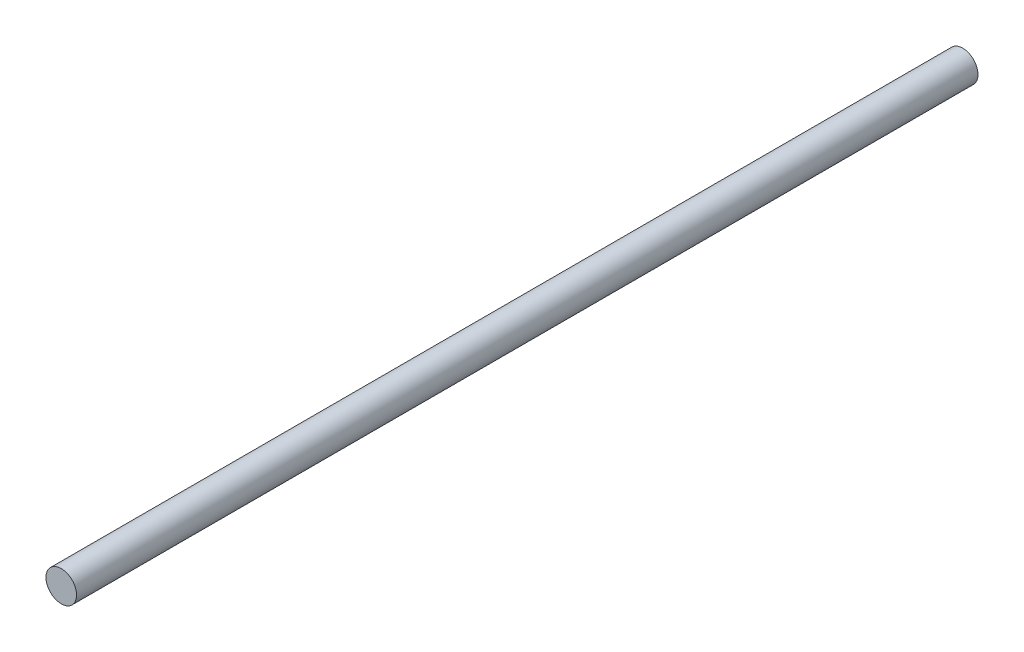
ISO-10303-21;
HEADER;
FILE_DESCRIPTION(('STEP AP214'),'2;1');
FILE_NAME('part.step','',(''),(''),'','','');
FILE_SCHEMA(('AUTOMOTIVE_DESIGN { 1 0 10303 214 1 1 1 1 }'));
ENDSEC;
DATA;
#1=APPLICATION_CONTEXT('core data for automotive mechanical design processes');
#2=APPLICATION_PROTOCOL_DEFINITION('international standard','automotive_design',2000,#1);
#3=PRODUCT_CONTEXT('',#1,'mechanical');
#4=PRODUCT('Part','Part','',(#3));
#5=PRODUCT_RELATED_PRODUCT_CATEGORY('part','',(#4));
#6=PRODUCT_DEFINITION_FORMATION('','',#4);
#7=PRODUCT_DEFINITION_CONTEXT('part definition',#1,'design');
#8=PRODUCT_DEFINITION('design','',#6,#7);
#9=PRODUCT_DEFINITION_SHAPE('','',#8);
#10=(LENGTH_UNIT() NAMED_UNIT(*) SI_UNIT(.MILLI.,.METRE.));
#11=(NAMED_UNIT(*) PLANE_ANGLE_UNIT() SI_UNIT($,.RADIAN.));
#12=(NAMED_UNIT(*) SI_UNIT($,.STERADIAN.) SOLID_ANGLE_UNIT());
#13=UNCERTAINTY_MEASURE_WITH_UNIT(LENGTH_MEASURE(1.E-05),#10,'distance_accuracy_value','');
#14=(GEOMETRIC_REPRESENTATION_CONTEXT(3) GLOBAL_UNCERTAINTY_ASSIGNED_CONTEXT((#13)) GLOBAL_UNIT_ASSIGNED_CONTEXT((#10,
#11,#12)) REPRESENTATION_CONTEXT('',''));
#15=CARTESIAN_POINT('',(0.,0.,0.));
#16=DIRECTION('',(0.,0.,1.));
#17=DIRECTION('',(1.,0.,0.));
#18=AXIS2_PLACEMENT_3D('',#15,#16,#17);
#19=CARTESIAN_POINT('',(0.,0.,115.));
#20=DIRECTION('',(0.,0.,-1.));
#21=DIRECTION('',(-1.,0.,0.));
#22=AXIS2_PLACEMENT_3D('',#19,#20,#21);
#23=CYLINDRICAL_SURFACE('',#22,1.95);
#24=CARTESIAN_POINT('',(0.,0.,115.));
#25=DIRECTION('',(0.,0.,1.));
#26=DIRECTION('',(1.,0.,0.));
#27=AXIS2_PLACEMENT_3D('',#24,#25,#26);
#28=CIRCLE('',#27,1.95);
#29=CARTESIAN_POINT('',(1.95,0.,115.));
#30=VERTEX_POINT('',#29);
#31=EDGE_CURVE('E10',#30,#30,#28,.T.);
#32=ORIENTED_EDGE('',*,*,#31,.F.);
#33=EDGE_LOOP('',(#32));
#34=FACE_BOUND('',#33,.T.);
#35=CARTESIAN_POINT('',(0.,0.,0.));
#36=DIRECTION('',(0.,0.,1.));
#37=DIRECTION('',(1.,0.,0.));
#38=AXIS2_PLACEMENT_3D('',#35,#36,#37);
#39=CIRCLE('',#38,1.95);
#40=CARTESIAN_POINT('',(1.95,0.,0.));
#41=VERTEX_POINT('',#40);
#42=EDGE_CURVE('E36',#41,#41,#39,.T.);
#43=ORIENTED_EDGE('',*,*,#42,.T.);
#44=EDGE_LOOP('',(#43));
#45=FACE_BOUND('',#44,.T.);
#46=ADVANCED_FACE('F33',(#34,#45),#23,.T.);
#47=CARTESIAN_POINT('',(0.,0.,115.));
#48=DIRECTION('',(0.,0.,1.));
#49=DIRECTION('',(1.,0.,0.));
#50=AXIS2_PLACEMENT_3D('',#47,#48,#49);
#51=PLANE('',#50);
#52=ORIENTED_EDGE('',*,*,#31,.T.);
#53=EDGE_LOOP('',(#52));
#54=FACE_BOUND('',#53,.T.);
#55=ADVANCED_FACE('F48',(#54),#51,.T.);
#56=CARTESIAN_POINT('',(0.,0.,0.));
#57=DIRECTION('',(0.,0.,1.));
#58=DIRECTION('',(1.,0.,0.));
#59=AXIS2_PLACEMENT_3D('',#56,#57,#58);
#60=PLANE('',#59);
#61=ORIENTED_EDGE('',*,*,#42,.F.);
#62=EDGE_LOOP('',(#61));
#63=FACE_BOUND('',#62,.T.);
#64=ADVANCED_FACE('F46',(#63),#60,.F.);
#65=CLOSED_SHELL('',(#46,#55,#64));
#66=MANIFOLD_SOLID_BREP('B2',#65);
#67=ADVANCED_BREP_SHAPE_REPRESENTATION('',(#18,#66),#14);
#68=SHAPE_DEFINITION_REPRESENTATION(#9,#67);
ENDSEC;
END-ISO-10303-21;
